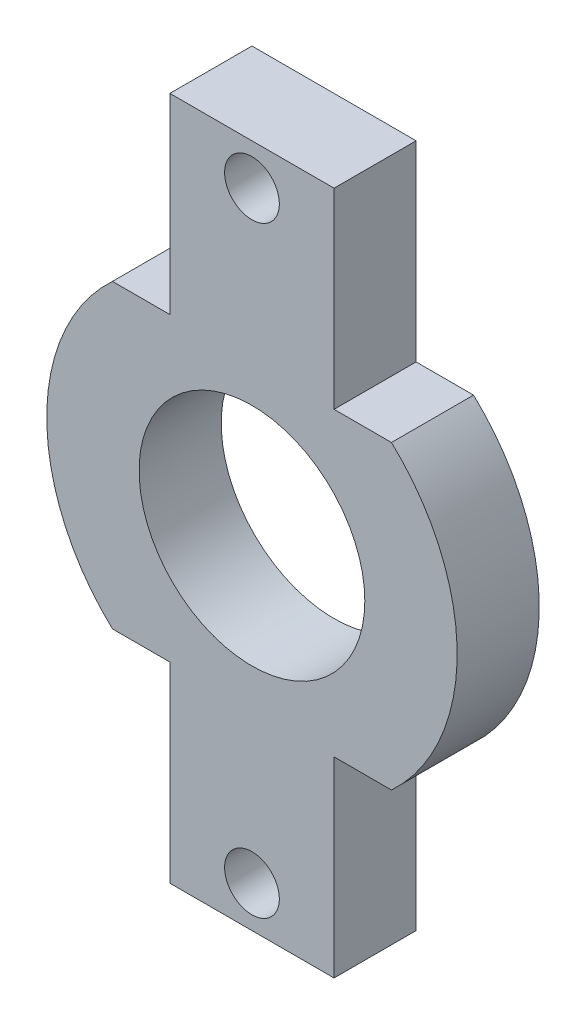
ISO-10303-21;
HEADER;
FILE_DESCRIPTION(('STEP AP214'),'2;1');
FILE_NAME('part.step','',(''),(''),'','','');
FILE_SCHEMA(('AUTOMOTIVE_DESIGN { 1 0 10303 214 1 1 1 1 }'));
ENDSEC;
DATA;
#1=APPLICATION_CONTEXT('core data for automotive mechanical design processes');
#2=APPLICATION_PROTOCOL_DEFINITION('international standard','automotive_design',2000,#1);
#3=PRODUCT_CONTEXT('',#1,'mechanical');
#4=PRODUCT('Part','Part','',(#3));
#5=PRODUCT_RELATED_PRODUCT_CATEGORY('part','',(#4));
#6=PRODUCT_DEFINITION_FORMATION('','',#4);
#7=PRODUCT_DEFINITION_CONTEXT('part definition',#1,'design');
#8=PRODUCT_DEFINITION('design','',#6,#7);
#9=PRODUCT_DEFINITION_SHAPE('','',#8);
#10=(LENGTH_UNIT() NAMED_UNIT(*) SI_UNIT(.MILLI.,.METRE.));
#11=(NAMED_UNIT(*) PLANE_ANGLE_UNIT() SI_UNIT($,.RADIAN.));
#12=(NAMED_UNIT(*) SI_UNIT($,.STERADIAN.) SOLID_ANGLE_UNIT());
#13=UNCERTAINTY_MEASURE_WITH_UNIT(LENGTH_MEASURE(1.E-05),#10,'distance_accuracy_value','');
#14=(GEOMETRIC_REPRESENTATION_CONTEXT(3) GLOBAL_UNCERTAINTY_ASSIGNED_CONTEXT((#13)) GLOBAL_UNIT_ASSIGNED_CONTEXT((#10,
#11,#12)) REPRESENTATION_CONTEXT('',''));
#15=CARTESIAN_POINT('',(0.,0.,0.));
#16=DIRECTION('',(0.,0.,1.));
#17=DIRECTION('',(1.,0.,0.));
#18=AXIS2_PLACEMENT_3D('',#15,#16,#17);
#19=CARTESIAN_POINT('',(0.,0.,6.));
#20=DIRECTION('',(0.,0.,1.));
#21=DIRECTION('',(1.,0.,0.));
#22=AXIS2_PLACEMENT_3D('',#19,#20,#21);
#23=PLANE('',#22);
#24=CARTESIAN_POINT('',(0.,-22.,6.));
#25=DIRECTION('',(0.,0.,-1.));
#26=DIRECTION('',(-1.,0.,0.));
#27=AXIS2_PLACEMENT_3D('',#24,#25,#26);
#28=CIRCLE('',#27,2.);
#29=CARTESIAN_POINT('',(-2.,-22.,6.));
#30=VERTEX_POINT('',#29);
#31=EDGE_CURVE('E280',#30,#30,#28,.T.);
#32=ORIENTED_EDGE('',*,*,#31,.T.);
#33=EDGE_LOOP('',(#32));
#34=FACE_BOUND('',#33,.T.);
#35=CARTESIAN_POINT('',(0.,22.,6.));
#36=DIRECTION('',(0.,0.,-1.));
#37=DIRECTION('',(-1.,0.,0.));
#38=AXIS2_PLACEMENT_3D('',#35,#36,#37);
#39=CIRCLE('',#38,2.);
#40=CARTESIAN_POINT('',(-2.,22.,6.));
#41=VERTEX_POINT('',#40);
#42=EDGE_CURVE('E288',#41,#41,#39,.T.);
#43=ORIENTED_EDGE('',*,*,#42,.T.);
#44=EDGE_LOOP('',(#43));
#45=FACE_BOUND('',#44,.T.);
#46=DIRECTION('',(1.,0.,0.));
#47=VECTOR('',#46,1.);
#48=CARTESIAN_POINT('',(-6.,-25.,6.));
#49=LINE('',#48,#47);
#50=CARTESIAN_POINT('',(-6.,-25.,6.));
#51=VERTEX_POINT('',#50);
#52=CARTESIAN_POINT('',(6.,-25.,6.));
#53=VERTEX_POINT('',#52);
#54=EDGE_CURVE('E179',#51,#53,#49,.T.);
#55=ORIENTED_EDGE('',*,*,#54,.T.);
#56=DIRECTION('',(0.,1.,0.));
#57=VECTOR('',#56,1.);
#58=CARTESIAN_POINT('',(6.,-25.,6.));
#59=LINE('',#58,#57);
#60=CARTESIAN_POINT('',(6.,-11.,6.));
#61=VERTEX_POINT('',#60);
#62=EDGE_CURVE('E107',#53,#61,#59,.T.);
#63=ORIENTED_EDGE('',*,*,#62,.T.);
#64=DIRECTION('',(1.,0.,0.));
#65=VECTOR('',#64,1.);
#66=CARTESIAN_POINT('',(10.1980390271856,-11.,6.));
#67=LINE('',#66,#65);
#68=CARTESIAN_POINT('',(10.1980390271856,-11.,6.));
#69=VERTEX_POINT('',#68);
#70=EDGE_CURVE('E206',#61,#69,#67,.T.);
#71=ORIENTED_EDGE('',*,*,#70,.T.);
#72=CARTESIAN_POINT('',(0.,0.,6.));
#73=DIRECTION('',(0.,0.,1.));
#74=DIRECTION('',(1.,0.,0.));
#75=AXIS2_PLACEMENT_3D('',#72,#73,#74);
#76=CIRCLE('',#75,15.);
#77=CARTESIAN_POINT('',(10.1980390271856,11.,6.));
#78=VERTEX_POINT('',#77);
#79=EDGE_CURVE('E225',#69,#78,#76,.T.);
#80=ORIENTED_EDGE('',*,*,#79,.T.);
#81=DIRECTION('',(-1.,0.,0.));
#82=VECTOR('',#81,1.);
#83=CARTESIAN_POINT('',(6.,11.,6.));
#84=LINE('',#83,#82);
#85=CARTESIAN_POINT('',(6.,11.,6.));
#86=VERTEX_POINT('',#85);
#87=EDGE_CURVE('E222',#78,#86,#84,.T.);
#88=ORIENTED_EDGE('',*,*,#87,.T.);
#89=DIRECTION('',(0.,1.,0.));
#90=VECTOR('',#89,1.);
#91=CARTESIAN_POINT('',(6.,11.,6.));
#92=LINE('',#91,#90);
#93=CARTESIAN_POINT('',(6.,25.,6.));
#94=VERTEX_POINT('',#93);
#95=EDGE_CURVE('E224',#86,#94,#92,.T.);
#96=ORIENTED_EDGE('',*,*,#95,.T.);
#97=DIRECTION('',(-1.,0.,0.));
#98=VECTOR('',#97,1.);
#99=CARTESIAN_POINT('',(-6.,25.,6.));
#100=LINE('',#99,#98);
#101=CARTESIAN_POINT('',(-6.,25.,6.));
#102=VERTEX_POINT('',#101);
#103=EDGE_CURVE('E227',#94,#102,#100,.T.);
#104=ORIENTED_EDGE('',*,*,#103,.T.);
#105=DIRECTION('',(0.,-1.,0.));
#106=VECTOR('',#105,1.);
#107=CARTESIAN_POINT('',(-6.,11.,6.));
#108=LINE('',#107,#106);
#109=CARTESIAN_POINT('',(-6.,11.,6.));
#110=VERTEX_POINT('',#109);
#111=EDGE_CURVE('E233',#102,#110,#108,.T.);
#112=ORIENTED_EDGE('',*,*,#111,.T.);
#113=DIRECTION('',(-1.,0.,0.));
#114=VECTOR('',#113,1.);
#115=CARTESIAN_POINT('',(-10.1980390271856,11.,6.));
#116=LINE('',#115,#114);
#117=CARTESIAN_POINT('',(-10.1980390271856,11.,6.));
#118=VERTEX_POINT('',#117);
#119=EDGE_CURVE('E138',#110,#118,#116,.T.);
#120=ORIENTED_EDGE('',*,*,#119,.T.);
#121=CARTESIAN_POINT('',(0.,0.,6.));
#122=DIRECTION('',(0.,0.,1.));
#123=DIRECTION('',(1.,0.,0.));
#124=AXIS2_PLACEMENT_3D('',#121,#122,#123);
#125=CIRCLE('',#124,15.);
#126=CARTESIAN_POINT('',(-10.1980390271856,-11.,6.));
#127=VERTEX_POINT('',#126);
#128=EDGE_CURVE('E132',#118,#127,#125,.T.);
#129=ORIENTED_EDGE('',*,*,#128,.T.);
#130=DIRECTION('',(1.,0.,0.));
#131=VECTOR('',#130,1.);
#132=CARTESIAN_POINT('',(-6.,-11.,6.));
#133=LINE('',#132,#131);
#134=CARTESIAN_POINT('',(-6.,-11.,6.));
#135=VERTEX_POINT('',#134);
#136=EDGE_CURVE('E136',#127,#135,#133,.T.);
#137=ORIENTED_EDGE('',*,*,#136,.T.);
#138=DIRECTION('',(0.,-1.,0.));
#139=VECTOR('',#138,1.);
#140=CARTESIAN_POINT('',(-6.,-25.,6.));
#141=LINE('',#140,#139);
#142=EDGE_CURVE('E52',#135,#51,#141,.T.);
#143=ORIENTED_EDGE('',*,*,#142,.T.);
#144=EDGE_LOOP('',(#55,#63,#71,#80,#88,#96,#104,#112,#120,#129,#137,#143));
#145=FACE_BOUND('',#144,.T.);
#146=CARTESIAN_POINT('',(0.,0.,6.));
#147=DIRECTION('',(0.,0.,1.));
#148=DIRECTION('',(1.,0.,0.));
#149=AXIS2_PLACEMENT_3D('',#146,#147,#148);
#150=CIRCLE('',#149,8.25);
#151=CARTESIAN_POINT('',(8.25,0.,6.));
#152=VERTEX_POINT('',#151);
#153=EDGE_CURVE('E160',#152,#152,#150,.T.);
#154=ORIENTED_EDGE('',*,*,#153,.F.);
#155=EDGE_LOOP('',(#154));
#156=FACE_BOUND('',#155,.T.);
#157=ADVANCED_FACE('F35',(#34,#45,#145,#156),#23,.T.);
#158=CARTESIAN_POINT('',(0.,0.,0.));
#159=DIRECTION('',(0.,0.,1.));
#160=DIRECTION('',(1.,0.,0.));
#161=AXIS2_PLACEMENT_3D('',#158,#159,#160);
#162=PLANE('',#161);
#163=CARTESIAN_POINT('',(0.,-22.,0.));
#164=DIRECTION('',(0.,0.,-1.));
#165=DIRECTION('',(-1.,0.,0.));
#166=AXIS2_PLACEMENT_3D('',#163,#164,#165);
#167=CIRCLE('',#166,2.);
#168=CARTESIAN_POINT('',(-2.,-22.,0.));
#169=VERTEX_POINT('',#168);
#170=EDGE_CURVE('E283',#169,#169,#167,.T.);
#171=ORIENTED_EDGE('',*,*,#170,.F.);
#172=EDGE_LOOP('',(#171));
#173=FACE_BOUND('',#172,.T.);
#174=CARTESIAN_POINT('',(0.,22.,0.));
#175=DIRECTION('',(0.,0.,-1.));
#176=DIRECTION('',(-1.,0.,0.));
#177=AXIS2_PLACEMENT_3D('',#174,#175,#176);
#178=CIRCLE('',#177,2.);
#179=CARTESIAN_POINT('',(-2.,22.,0.));
#180=VERTEX_POINT('',#179);
#181=EDGE_CURVE('E285',#180,#180,#178,.T.);
#182=ORIENTED_EDGE('',*,*,#181,.F.);
#183=EDGE_LOOP('',(#182));
#184=FACE_BOUND('',#183,.T.);
#185=DIRECTION('',(1.,0.,0.));
#186=VECTOR('',#185,1.);
#187=CARTESIAN_POINT('',(-6.,-25.,0.));
#188=LINE('',#187,#186);
#189=CARTESIAN_POINT('',(-6.,-25.,0.));
#190=VERTEX_POINT('',#189);
#191=CARTESIAN_POINT('',(6.,-25.,0.));
#192=VERTEX_POINT('',#191);
#193=EDGE_CURVE('E156',#190,#192,#188,.T.);
#194=ORIENTED_EDGE('',*,*,#193,.F.);
#195=DIRECTION('',(0.,-1.,0.));
#196=VECTOR('',#195,1.);
#197=CARTESIAN_POINT('',(-6.,-25.,0.));
#198=LINE('',#197,#196);
#199=CARTESIAN_POINT('',(-6.,-11.,0.));
#200=VERTEX_POINT('',#199);
#201=EDGE_CURVE('E99',#200,#190,#198,.T.);
#202=ORIENTED_EDGE('',*,*,#201,.F.);
#203=DIRECTION('',(1.,0.,0.));
#204=VECTOR('',#203,1.);
#205=CARTESIAN_POINT('',(-6.,-11.,0.));
#206=LINE('',#205,#204);
#207=CARTESIAN_POINT('',(-10.1980390271856,-11.,0.));
#208=VERTEX_POINT('',#207);
#209=EDGE_CURVE('E93',#208,#200,#206,.T.);
#210=ORIENTED_EDGE('',*,*,#209,.F.);
#211=CARTESIAN_POINT('',(0.,0.,0.));
#212=DIRECTION('',(0.,0.,1.));
#213=DIRECTION('',(1.,0.,0.));
#214=AXIS2_PLACEMENT_3D('',#211,#212,#213);
#215=CIRCLE('',#214,15.);
#216=CARTESIAN_POINT('',(-10.1980390271856,11.,0.));
#217=VERTEX_POINT('',#216);
#218=EDGE_CURVE('E146',#217,#208,#215,.T.);
#219=ORIENTED_EDGE('',*,*,#218,.F.);
#220=DIRECTION('',(-1.,0.,0.));
#221=VECTOR('',#220,1.);
#222=CARTESIAN_POINT('',(-10.1980390271856,11.,0.));
#223=LINE('',#222,#221);
#224=CARTESIAN_POINT('',(-6.,11.,0.));
#225=VERTEX_POINT('',#224);
#226=EDGE_CURVE('E174',#225,#217,#223,.T.);
#227=ORIENTED_EDGE('',*,*,#226,.F.);
#228=DIRECTION('',(0.,-1.,0.));
#229=VECTOR('',#228,1.);
#230=CARTESIAN_POINT('',(-6.,11.,0.));
#231=LINE('',#230,#229);
#232=CARTESIAN_POINT('',(-6.,25.,0.));
#233=VERTEX_POINT('',#232);
#234=EDGE_CURVE('E172',#233,#225,#231,.T.);
#235=ORIENTED_EDGE('',*,*,#234,.F.);
#236=DIRECTION('',(-1.,0.,0.));
#237=VECTOR('',#236,1.);
#238=CARTESIAN_POINT('',(-6.,25.,0.));
#239=LINE('',#238,#237);
#240=CARTESIAN_POINT('',(6.,25.,0.));
#241=VERTEX_POINT('',#240);
#242=EDGE_CURVE('E170',#241,#233,#239,.T.);
#243=ORIENTED_EDGE('',*,*,#242,.F.);
#244=DIRECTION('',(0.,1.,0.));
#245=VECTOR('',#244,1.);
#246=CARTESIAN_POINT('',(6.,11.,0.));
#247=LINE('',#246,#245);
#248=CARTESIAN_POINT('',(6.,11.,0.));
#249=VERTEX_POINT('',#248);
#250=EDGE_CURVE('E168',#249,#241,#247,.T.);
#251=ORIENTED_EDGE('',*,*,#250,.F.);
#252=DIRECTION('',(-1.,0.,0.));
#253=VECTOR('',#252,1.);
#254=CARTESIAN_POINT('',(6.,11.,0.));
#255=LINE('',#254,#253);
#256=CARTESIAN_POINT('',(10.1980390271856,11.,0.));
#257=VERTEX_POINT('',#256);
#258=EDGE_CURVE('E166',#257,#249,#255,.T.);
#259=ORIENTED_EDGE('',*,*,#258,.F.);
#260=CARTESIAN_POINT('',(0.,0.,0.));
#261=DIRECTION('',(0.,0.,1.));
#262=DIRECTION('',(1.,0.,0.));
#263=AXIS2_PLACEMENT_3D('',#260,#261,#262);
#264=CIRCLE('',#263,15.);
#265=CARTESIAN_POINT('',(10.1980390271856,-11.,0.));
#266=VERTEX_POINT('',#265);
#267=EDGE_CURVE('E164',#266,#257,#264,.T.);
#268=ORIENTED_EDGE('',*,*,#267,.F.);
#269=DIRECTION('',(1.,0.,0.));
#270=VECTOR('',#269,1.);
#271=CARTESIAN_POINT('',(10.1980390271856,-11.,0.));
#272=LINE('',#271,#270);
#273=CARTESIAN_POINT('',(6.,-11.,0.));
#274=VERTEX_POINT('',#273);
#275=EDGE_CURVE('E162',#274,#266,#272,.T.);
#276=ORIENTED_EDGE('',*,*,#275,.F.);
#277=DIRECTION('',(0.,1.,0.));
#278=VECTOR('',#277,1.);
#279=CARTESIAN_POINT('',(6.,-25.,0.));
#280=LINE('',#279,#278);
#281=EDGE_CURVE('E159',#192,#274,#280,.T.);
#282=ORIENTED_EDGE('',*,*,#281,.F.);
#283=EDGE_LOOP('',(#194,#202,#210,#219,#227,#235,#243,#251,#259,#268,#276,#282));
#284=FACE_BOUND('',#283,.T.);
#285=CARTESIAN_POINT('',(0.,0.,0.));
#286=DIRECTION('',(0.,0.,1.));
#287=DIRECTION('',(1.,0.,0.));
#288=AXIS2_PLACEMENT_3D('',#285,#286,#287);
#289=CIRCLE('',#288,8.25);
#290=CARTESIAN_POINT('',(8.25,0.,0.));
#291=VERTEX_POINT('',#290);
#292=EDGE_CURVE('E291',#291,#291,#289,.T.);
#293=ORIENTED_EDGE('',*,*,#292,.T.);
#294=EDGE_LOOP('',(#293));
#295=FACE_BOUND('',#294,.T.);
#296=ADVANCED_FACE('F210',(#173,#184,#284,#295),#162,.F.);
#297=CARTESIAN_POINT('',(-6.,-25.,6.));
#298=DIRECTION('',(0.,1.,0.));
#299=DIRECTION('',(0.,0.,1.));
#300=AXIS2_PLACEMENT_3D('',#297,#298,#299);
#301=PLANE('',#300);
#302=ORIENTED_EDGE('',*,*,#193,.T.);
#303=DIRECTION('',(0.,0.,-1.));
#304=VECTOR('',#303,1.);
#305=CARTESIAN_POINT('',(6.,-25.,6.));
#306=LINE('',#305,#304);
#307=EDGE_CURVE('E11',#53,#192,#306,.T.);
#308=ORIENTED_EDGE('',*,*,#307,.F.);
#309=ORIENTED_EDGE('',*,*,#54,.F.);
#310=DIRECTION('',(0.,0.,-1.));
#311=VECTOR('',#310,1.);
#312=CARTESIAN_POINT('',(-6.,-25.,6.));
#313=LINE('',#312,#311);
#314=EDGE_CURVE('E152',#51,#190,#313,.T.);
#315=ORIENTED_EDGE('',*,*,#314,.T.);
#316=EDGE_LOOP('',(#302,#308,#309,#315));
#317=FACE_BOUND('',#316,.T.);
#318=ADVANCED_FACE('F37',(#317),#301,.F.);
#319=CARTESIAN_POINT('',(6.,-25.,6.));
#320=DIRECTION('',(-1.,0.,0.));
#321=DIRECTION('',(0.,0.,1.));
#322=AXIS2_PLACEMENT_3D('',#319,#320,#321);
#323=PLANE('',#322);
#324=ORIENTED_EDGE('',*,*,#281,.T.);
#325=DIRECTION('',(0.,0.,-1.));
#326=VECTOR('',#325,1.);
#327=CARTESIAN_POINT('',(6.,-11.,6.));
#328=LINE('',#327,#326);
#329=EDGE_CURVE('E44',#61,#274,#328,.T.);
#330=ORIENTED_EDGE('',*,*,#329,.F.);
#331=ORIENTED_EDGE('',*,*,#62,.F.);
#332=ORIENTED_EDGE('',*,*,#307,.T.);
#333=EDGE_LOOP('',(#324,#330,#331,#332));
#334=FACE_BOUND('',#333,.T.);
#335=ADVANCED_FACE('F336',(#334),#323,.F.);
#336=CARTESIAN_POINT('',(10.1980390271856,-11.,6.));
#337=DIRECTION('',(0.,1.,0.));
#338=DIRECTION('',(-1.,0.,0.));
#339=AXIS2_PLACEMENT_3D('',#336,#337,#338);
#340=PLANE('',#339);
#341=ORIENTED_EDGE('',*,*,#275,.T.);
#342=DIRECTION('',(0.,0.,-1.));
#343=VECTOR('',#342,1.);
#344=CARTESIAN_POINT('',(10.1980390271856,-11.,6.));
#345=LINE('',#344,#343);
#346=EDGE_CURVE('E198',#69,#266,#345,.T.);
#347=ORIENTED_EDGE('',*,*,#346,.F.);
#348=ORIENTED_EDGE('',*,*,#70,.F.);
#349=ORIENTED_EDGE('',*,*,#329,.T.);
#350=EDGE_LOOP('',(#341,#347,#348,#349));
#351=FACE_BOUND('',#350,.T.);
#352=ADVANCED_FACE('F204',(#351),#340,.F.);
#353=CARTESIAN_POINT('',(0.,0.,6.));
#354=DIRECTION('',(0.,0.,-1.));
#355=DIRECTION('',(-1.,0.,0.));
#356=AXIS2_PLACEMENT_3D('',#353,#354,#355);
#357=CYLINDRICAL_SURFACE('',#356,15.);
#358=ORIENTED_EDGE('',*,*,#267,.T.);
#359=DIRECTION('',(0.,0.,-1.));
#360=VECTOR('',#359,1.);
#361=CARTESIAN_POINT('',(10.1980390271856,11.,6.));
#362=LINE('',#361,#360);
#363=EDGE_CURVE('E195',#78,#257,#362,.T.);
#364=ORIENTED_EDGE('',*,*,#363,.F.);
#365=ORIENTED_EDGE('',*,*,#79,.F.);
#366=ORIENTED_EDGE('',*,*,#346,.T.);
#367=EDGE_LOOP('',(#358,#364,#365,#366));
#368=FACE_BOUND('',#367,.T.);
#369=ADVANCED_FACE('F216',(#368),#357,.T.);
#370=CARTESIAN_POINT('',(6.,11.,6.));
#371=DIRECTION('',(0.,-1.,0.));
#372=DIRECTION('',(0.,0.,-1.));
#373=AXIS2_PLACEMENT_3D('',#370,#371,#372);
#374=PLANE('',#373);
#375=ORIENTED_EDGE('',*,*,#258,.T.);
#376=DIRECTION('',(0.,0.,-1.));
#377=VECTOR('',#376,1.);
#378=CARTESIAN_POINT('',(6.,11.,6.));
#379=LINE('',#378,#377);
#380=EDGE_CURVE('E192',#86,#249,#379,.T.);
#381=ORIENTED_EDGE('',*,*,#380,.F.);
#382=ORIENTED_EDGE('',*,*,#87,.F.);
#383=ORIENTED_EDGE('',*,*,#363,.T.);
#384=EDGE_LOOP('',(#375,#381,#382,#383));
#385=FACE_BOUND('',#384,.T.);
#386=ADVANCED_FACE('F220',(#385),#374,.F.);
#387=CARTESIAN_POINT('',(6.,11.,6.));
#388=DIRECTION('',(-1.,0.,0.));
#389=DIRECTION('',(0.,0.,1.));
#390=AXIS2_PLACEMENT_3D('',#387,#388,#389);
#391=PLANE('',#390);
#392=ORIENTED_EDGE('',*,*,#250,.T.);
#393=DIRECTION('',(0.,0.,-1.));
#394=VECTOR('',#393,1.);
#395=CARTESIAN_POINT('',(6.,25.,6.));
#396=LINE('',#395,#394);
#397=EDGE_CURVE('E189',#94,#241,#396,.T.);
#398=ORIENTED_EDGE('',*,*,#397,.F.);
#399=ORIENTED_EDGE('',*,*,#95,.F.);
#400=ORIENTED_EDGE('',*,*,#380,.T.);
#401=EDGE_LOOP('',(#392,#398,#399,#400));
#402=FACE_BOUND('',#401,.T.);
#403=ADVANCED_FACE('F358',(#402),#391,.F.);
#404=CARTESIAN_POINT('',(-6.,25.,6.));
#405=DIRECTION('',(0.,-1.,0.));
#406=DIRECTION('',(0.,0.,-1.));
#407=AXIS2_PLACEMENT_3D('',#404,#405,#406);
#408=PLANE('',#407);
#409=ORIENTED_EDGE('',*,*,#242,.T.);
#410=DIRECTION('',(0.,0.,-1.));
#411=VECTOR('',#410,1.);
#412=CARTESIAN_POINT('',(-6.,25.,6.));
#413=LINE('',#412,#411);
#414=EDGE_CURVE('E186',#102,#233,#413,.T.);
#415=ORIENTED_EDGE('',*,*,#414,.F.);
#416=ORIENTED_EDGE('',*,*,#103,.F.);
#417=ORIENTED_EDGE('',*,*,#397,.T.);
#418=EDGE_LOOP('',(#409,#415,#416,#417));
#419=FACE_BOUND('',#418,.T.);
#420=ADVANCED_FACE('F365',(#419),#408,.F.);
#421=CARTESIAN_POINT('',(-6.,11.,6.));
#422=DIRECTION('',(1.,0.,0.));
#423=DIRECTION('',(0.,0.,-1.));
#424=AXIS2_PLACEMENT_3D('',#421,#422,#423);
#425=PLANE('',#424);
#426=ORIENTED_EDGE('',*,*,#234,.T.);
#427=DIRECTION('',(0.,0.,-1.));
#428=VECTOR('',#427,1.);
#429=CARTESIAN_POINT('',(-6.,11.,6.));
#430=LINE('',#429,#428);
#431=EDGE_CURVE('E183',#110,#225,#430,.T.);
#432=ORIENTED_EDGE('',*,*,#431,.F.);
#433=ORIENTED_EDGE('',*,*,#111,.F.);
#434=ORIENTED_EDGE('',*,*,#414,.T.);
#435=EDGE_LOOP('',(#426,#432,#433,#434));
#436=FACE_BOUND('',#435,.T.);
#437=ADVANCED_FACE('F239',(#436),#425,.F.);
#438=CARTESIAN_POINT('',(-10.1980390271856,11.,6.));
#439=DIRECTION('',(0.,-1.,0.));
#440=DIRECTION('',(0.,0.,-1.));
#441=AXIS2_PLACEMENT_3D('',#438,#439,#440);
#442=PLANE('',#441);
#443=ORIENTED_EDGE('',*,*,#226,.T.);
#444=DIRECTION('',(0.,0.,-1.));
#445=VECTOR('',#444,1.);
#446=CARTESIAN_POINT('',(-10.1980390271856,11.,6.));
#447=LINE('',#446,#445);
#448=EDGE_CURVE('E147',#118,#217,#447,.T.);
#449=ORIENTED_EDGE('',*,*,#448,.F.);
#450=ORIENTED_EDGE('',*,*,#119,.F.);
#451=ORIENTED_EDGE('',*,*,#431,.T.);
#452=EDGE_LOOP('',(#443,#449,#450,#451));
#453=FACE_BOUND('',#452,.T.);
#454=ADVANCED_FACE('F243',(#453),#442,.F.);
#455=CARTESIAN_POINT('',(0.,0.,6.));
#456=DIRECTION('',(0.,0.,-1.));
#457=DIRECTION('',(-1.,0.,0.));
#458=AXIS2_PLACEMENT_3D('',#455,#456,#457);
#459=CYLINDRICAL_SURFACE('',#458,15.);
#460=ORIENTED_EDGE('',*,*,#218,.T.);
#461=DIRECTION('',(0.,0.,-1.));
#462=VECTOR('',#461,1.);
#463=CARTESIAN_POINT('',(-10.1980390271856,-11.,6.));
#464=LINE('',#463,#462);
#465=EDGE_CURVE('E143',#127,#208,#464,.T.);
#466=ORIENTED_EDGE('',*,*,#465,.F.);
#467=ORIENTED_EDGE('',*,*,#128,.F.);
#468=ORIENTED_EDGE('',*,*,#448,.T.);
#469=EDGE_LOOP('',(#460,#466,#467,#468));
#470=FACE_BOUND('',#469,.T.);
#471=ADVANCED_FACE('F144',(#470),#459,.T.);
#472=CARTESIAN_POINT('',(-6.,-11.,6.));
#473=DIRECTION('',(0.,1.,0.));
#474=DIRECTION('',(-1.,0.,0.));
#475=AXIS2_PLACEMENT_3D('',#472,#473,#474);
#476=PLANE('',#475);
#477=ORIENTED_EDGE('',*,*,#209,.T.);
#478=DIRECTION('',(0.,0.,-1.));
#479=VECTOR('',#478,1.);
#480=CARTESIAN_POINT('',(-6.,-11.,6.));
#481=LINE('',#480,#479);
#482=EDGE_CURVE('E148',#135,#200,#481,.T.);
#483=ORIENTED_EDGE('',*,*,#482,.F.);
#484=ORIENTED_EDGE('',*,*,#136,.F.);
#485=ORIENTED_EDGE('',*,*,#465,.T.);
#486=EDGE_LOOP('',(#477,#483,#484,#485));
#487=FACE_BOUND('',#486,.T.);
#488=ADVANCED_FACE('F150',(#487),#476,.F.);
#489=CARTESIAN_POINT('',(-6.,-25.,6.));
#490=DIRECTION('',(1.,0.,0.));
#491=DIRECTION('',(0.,0.,-1.));
#492=AXIS2_PLACEMENT_3D('',#489,#490,#491);
#493=PLANE('',#492);
#494=ORIENTED_EDGE('',*,*,#201,.T.);
#495=ORIENTED_EDGE('',*,*,#314,.F.);
#496=ORIENTED_EDGE('',*,*,#142,.F.);
#497=ORIENTED_EDGE('',*,*,#482,.T.);
#498=EDGE_LOOP('',(#494,#495,#496,#497));
#499=FACE_BOUND('',#498,.T.);
#500=ADVANCED_FACE('F247',(#499),#493,.F.);
#501=CARTESIAN_POINT('',(0.,0.,6.));
#502=DIRECTION('',(0.,0.,-1.));
#503=DIRECTION('',(-1.,0.,0.));
#504=AXIS2_PLACEMENT_3D('',#501,#502,#503);
#505=CYLINDRICAL_SURFACE('',#504,8.25);
#506=ORIENTED_EDGE('',*,*,#153,.T.);
#507=EDGE_LOOP('',(#506));
#508=FACE_BOUND('',#507,.T.);
#509=ORIENTED_EDGE('',*,*,#292,.F.);
#510=EDGE_LOOP('',(#509));
#511=FACE_BOUND('',#510,.T.);
#512=ADVANCED_FACE('F249',(#508,#511),#505,.F.);
#513=CARTESIAN_POINT('',(0.,22.,6.));
#514=DIRECTION('',(0.,0.,-1.));
#515=DIRECTION('',(-1.,0.,0.));
#516=AXIS2_PLACEMENT_3D('',#513,#514,#515);
#517=CYLINDRICAL_SURFACE('',#516,2.);
#518=ORIENTED_EDGE('',*,*,#42,.F.);
#519=EDGE_LOOP('',(#518));
#520=FACE_BOUND('',#519,.T.);
#521=ORIENTED_EDGE('',*,*,#181,.T.);
#522=EDGE_LOOP('',(#521));
#523=FACE_BOUND('',#522,.T.);
#524=ADVANCED_FACE('F255',(#520,#523),#517,.F.);
#525=CARTESIAN_POINT('',(0.,-22.,6.));
#526=DIRECTION('',(0.,0.,-1.));
#527=DIRECTION('',(-1.,0.,0.));
#528=AXIS2_PLACEMENT_3D('',#525,#526,#527);
#529=CYLINDRICAL_SURFACE('',#528,2.);
#530=ORIENTED_EDGE('',*,*,#31,.F.);
#531=EDGE_LOOP('',(#530));
#532=FACE_BOUND('',#531,.T.);
#533=ORIENTED_EDGE('',*,*,#170,.T.);
#534=EDGE_LOOP('',(#533));
#535=FACE_BOUND('',#534,.T.);
#536=ADVANCED_FACE('F272',(#532,#535),#529,.F.);
#537=CLOSED_SHELL('',(#157,#296,#318,#335,#352,#369,#386,#403,#420,#437,#454,#471,#488,#500,
#512,#524,#536));
#538=MANIFOLD_SOLID_BREP('B2',#537);
#539=ADVANCED_BREP_SHAPE_REPRESENTATION('',(#18,#538),#14);
#540=SHAPE_DEFINITION_REPRESENTATION(#9,#539);
ENDSEC;
END-ISO-10303-21;
